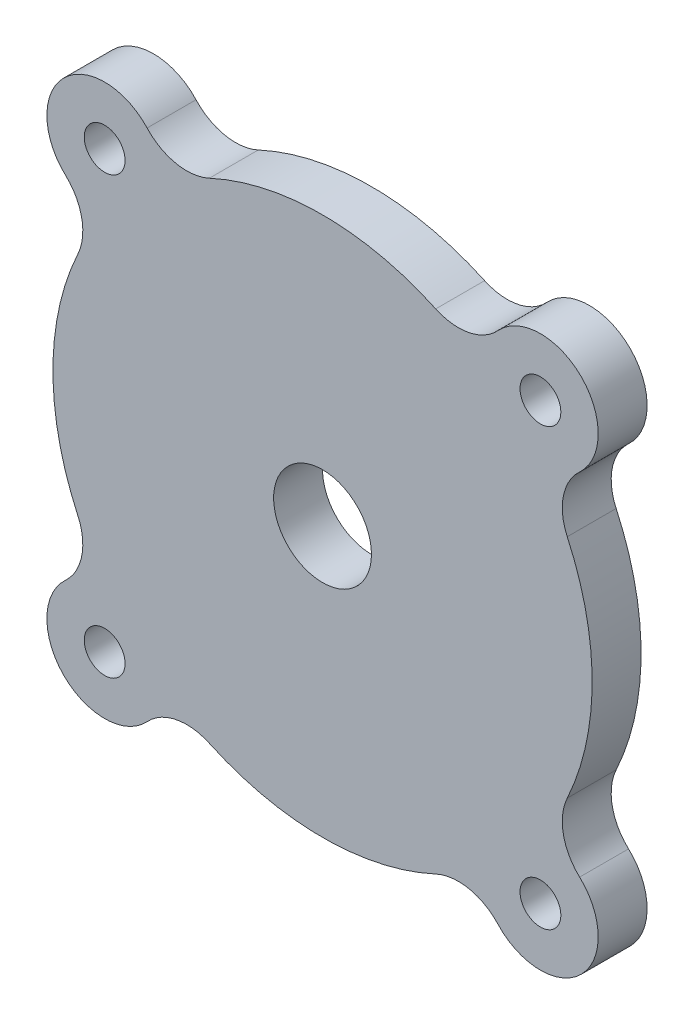
ISO-10303-21;
HEADER;
FILE_DESCRIPTION(('STEP AP214'),'2;1');
FILE_NAME('part.step','',(''),(''),'','','');
FILE_SCHEMA(('AUTOMOTIVE_DESIGN { 1 0 10303 214 1 1 1 1 }'));
ENDSEC;
DATA;
#1=APPLICATION_CONTEXT('core data for automotive mechanical design processes');
#2=APPLICATION_PROTOCOL_DEFINITION('international standard','automotive_design',2000,#1);
#3=PRODUCT_CONTEXT('',#1,'mechanical');
#4=PRODUCT('Part','Part','',(#3));
#5=PRODUCT_RELATED_PRODUCT_CATEGORY('part','',(#4));
#6=PRODUCT_DEFINITION_FORMATION('','',#4);
#7=PRODUCT_DEFINITION_CONTEXT('part definition',#1,'design');
#8=PRODUCT_DEFINITION('design','',#6,#7);
#9=PRODUCT_DEFINITION_SHAPE('','',#8);
#10=(LENGTH_UNIT() NAMED_UNIT(*) SI_UNIT(.MILLI.,.METRE.));
#11=(NAMED_UNIT(*) PLANE_ANGLE_UNIT() SI_UNIT($,.RADIAN.));
#12=(NAMED_UNIT(*) SI_UNIT($,.STERADIAN.) SOLID_ANGLE_UNIT());
#13=UNCERTAINTY_MEASURE_WITH_UNIT(LENGTH_MEASURE(1.E-05),#10,'distance_accuracy_value','');
#14=(GEOMETRIC_REPRESENTATION_CONTEXT(3) GLOBAL_UNCERTAINTY_ASSIGNED_CONTEXT((#13)) GLOBAL_UNIT_ASSIGNED_CONTEXT((#10,
#11,#12)) REPRESENTATION_CONTEXT('',''));
#15=CARTESIAN_POINT('',(0.,0.,0.));
#16=DIRECTION('',(0.,0.,1.));
#17=DIRECTION('',(1.,0.,0.));
#18=AXIS2_PLACEMENT_3D('',#15,#16,#17);
#19=CARTESIAN_POINT('',(0.,0.,3.175));
#20=DIRECTION('',(0.,0.,-1.));
#21=DIRECTION('',(-1.,0.,0.));
#22=AXIS2_PLACEMENT_3D('',#19,#20,#21);
#23=CYLINDRICAL_SURFACE('',#22,35.);
#24=CARTESIAN_POINT('',(0.,0.,3.175));
#25=DIRECTION('',(0.,0.,1.));
#26=DIRECTION('',(-1.,0.,0.));
#27=AXIS2_PLACEMENT_3D('',#24,#25,#26);
#28=CIRCLE('',#27,35.);
#29=CARTESIAN_POINT('',(14.6921496209077,31.7669756117396,3.175));
#30=VERTEX_POINT('',#29);
#31=CARTESIAN_POINT('',(-14.6921496209078,31.7669756117396,3.175));
#32=VERTEX_POINT('',#31);
#33=EDGE_CURVE('E198',#30,#32,#28,.T.);
#34=ORIENTED_EDGE('',*,*,#33,.F.);
#35=DIRECTION('',(0.,0.,-1.));
#36=VECTOR('',#35,1.);
#37=CARTESIAN_POINT('',(14.6921496209077,31.7669756117396,3.175));
#38=LINE('',#37,#36);
#39=CARTESIAN_POINT('',(14.6921496209077,31.7669756117396,-3.175));
#40=VERTEX_POINT('',#39);
#41=EDGE_CURVE('E160',#30,#40,#38,.T.);
#42=ORIENTED_EDGE('',*,*,#41,.T.);
#43=CARTESIAN_POINT('',(0.,0.,-3.175));
#44=DIRECTION('',(0.,0.,1.));
#45=DIRECTION('',(-1.,0.,0.));
#46=AXIS2_PLACEMENT_3D('',#43,#44,#45);
#47=CIRCLE('',#46,35.);
#48=CARTESIAN_POINT('',(-14.6921496209078,31.7669756117396,-3.175));
#49=VERTEX_POINT('',#48);
#50=EDGE_CURVE('E183',#40,#49,#47,.T.);
#51=ORIENTED_EDGE('',*,*,#50,.T.);
#52=DIRECTION('',(0.,0.,-1.));
#53=VECTOR('',#52,1.);
#54=CARTESIAN_POINT('',(-14.6921496209078,31.7669756117396,3.175));
#55=LINE('',#54,#53);
#56=EDGE_CURVE('E50',#49,#32,#55,.F.);
#57=ORIENTED_EDGE('',*,*,#56,.T.);
#58=EDGE_LOOP('',(#34,#42,#51,#57));
#59=FACE_BOUND('',#58,.T.);
#60=ADVANCED_FACE('F35',(#59),#23,.T.);
#61=CARTESIAN_POINT('',(-28.2842712474619,28.2842712474619,3.175));
#62=DIRECTION('',(0.,0.,-1.));
#63=DIRECTION('',(-1.,0.,0.));
#64=AXIS2_PLACEMENT_3D('',#61,#62,#63);
#65=CYLINDRICAL_SURFACE('',#64,7.50000000000001);
#66=CARTESIAN_POINT('',(-28.2842712474619,28.2842712474619,-3.175));
#67=DIRECTION('',(0.,0.,1.));
#68=DIRECTION('',(1.,0.,0.));
#69=AXIS2_PLACEMENT_3D('',#66,#67,#68);
#70=CIRCLE('',#69,7.50000000000001);
#71=CARTESIAN_POINT('',(-22.7737410565795,33.3719089129579,-3.175));
#72=VERTEX_POINT('',#71);
#73=CARTESIAN_POINT('',(-33.3719089129579,22.7737410565795,-3.175));
#74=VERTEX_POINT('',#73);
#75=EDGE_CURVE('E178',#72,#74,#70,.T.);
#76=ORIENTED_EDGE('',*,*,#75,.T.);
#77=DIRECTION('',(0.,0.,-1.));
#78=VECTOR('',#77,1.);
#79=CARTESIAN_POINT('',(-33.3719089129579,22.7737410565795,3.175));
#80=LINE('',#79,#78);
#81=CARTESIAN_POINT('',(-33.3719089129579,22.7737410565795,3.175));
#82=VERTEX_POINT('',#81);
#83=EDGE_CURVE('E154',#74,#82,#80,.F.);
#84=ORIENTED_EDGE('',*,*,#83,.T.);
#85=CARTESIAN_POINT('',(-28.2842712474619,28.2842712474619,3.175));
#86=DIRECTION('',(0.,0.,1.));
#87=DIRECTION('',(1.,0.,0.));
#88=AXIS2_PLACEMENT_3D('',#85,#86,#87);
#89=CIRCLE('',#88,7.50000000000001);
#90=CARTESIAN_POINT('',(-22.7737410565795,33.3719089129579,3.175));
#91=VERTEX_POINT('',#90);
#92=EDGE_CURVE('E262',#91,#82,#89,.T.);
#93=ORIENTED_EDGE('',*,*,#92,.F.);
#94=DIRECTION('',(0.,0.,-1.));
#95=VECTOR('',#94,1.);
#96=CARTESIAN_POINT('',(-22.7737410565795,33.3719089129579,3.175));
#97=LINE('',#96,#95);
#98=EDGE_CURVE('E170',#91,#72,#97,.T.);
#99=ORIENTED_EDGE('',*,*,#98,.T.);
#100=EDGE_LOOP('',(#76,#84,#93,#99));
#101=FACE_BOUND('',#100,.T.);
#102=ADVANCED_FACE('F264',(#101),#65,.T.);
#103=CARTESIAN_POINT('',(0.,0.,3.175));
#104=DIRECTION('',(0.,0.,-1.));
#105=DIRECTION('',(-1.,0.,0.));
#106=AXIS2_PLACEMENT_3D('',#103,#104,#105);
#107=CYLINDRICAL_SURFACE('',#106,35.);
#108=CARTESIAN_POINT('',(0.,0.,3.175));
#109=DIRECTION('',(0.,0.,1.));
#110=DIRECTION('',(-1.,0.,0.));
#111=AXIS2_PLACEMENT_3D('',#108,#109,#110);
#112=CIRCLE('',#111,35.);
#113=CARTESIAN_POINT('',(-31.7669756117396,14.6921496209078,3.175));
#114=VERTEX_POINT('',#113);
#115=CARTESIAN_POINT('',(-31.7669756117396,-14.6921496209078,3.175));
#116=VERTEX_POINT('',#115);
#117=EDGE_CURVE('E169',#114,#116,#112,.T.);
#118=ORIENTED_EDGE('',*,*,#117,.F.);
#119=DIRECTION('',(0.,0.,-1.));
#120=VECTOR('',#119,1.);
#121=CARTESIAN_POINT('',(-31.7669756117396,14.6921496209078,3.175));
#122=LINE('',#121,#120);
#123=CARTESIAN_POINT('',(-31.7669756117396,14.6921496209078,-3.175));
#124=VERTEX_POINT('',#123);
#125=EDGE_CURVE('E153',#114,#124,#122,.T.);
#126=ORIENTED_EDGE('',*,*,#125,.T.);
#127=CARTESIAN_POINT('',(0.,0.,-3.175));
#128=DIRECTION('',(0.,0.,1.));
#129=DIRECTION('',(-1.,0.,0.));
#130=AXIS2_PLACEMENT_3D('',#127,#128,#129);
#131=CIRCLE('',#130,35.);
#132=CARTESIAN_POINT('',(-31.7669756117396,-14.6921496209078,-3.175));
#133=VERTEX_POINT('',#132);
#134=EDGE_CURVE('E166',#124,#133,#131,.T.);
#135=ORIENTED_EDGE('',*,*,#134,.T.);
#136=DIRECTION('',(0.,0.,-1.));
#137=VECTOR('',#136,1.);
#138=CARTESIAN_POINT('',(-31.7669756117396,-14.6921496209078,3.175));
#139=LINE('',#138,#137);
#140=EDGE_CURVE('E171',#133,#116,#139,.F.);
#141=ORIENTED_EDGE('',*,*,#140,.T.);
#142=EDGE_LOOP('',(#118,#126,#135,#141));
#143=FACE_BOUND('',#142,.T.);
#144=ADVANCED_FACE('F165',(#143),#107,.T.);
#145=CARTESIAN_POINT('',(-28.2842712474619,-28.2842712474619,3.175));
#146=DIRECTION('',(0.,0.,-1.));
#147=DIRECTION('',(-1.,0.,0.));
#148=AXIS2_PLACEMENT_3D('',#145,#146,#147);
#149=CYLINDRICAL_SURFACE('',#148,7.50000000000001);
#150=CARTESIAN_POINT('',(-28.2842712474619,-28.2842712474619,3.175));
#151=DIRECTION('',(0.,0.,1.));
#152=DIRECTION('',(1.,0.,0.));
#153=AXIS2_PLACEMENT_3D('',#150,#151,#152);
#154=CIRCLE('',#153,7.50000000000001);
#155=CARTESIAN_POINT('',(-33.3719089129579,-22.7737410565795,3.175));
#156=VERTEX_POINT('',#155);
#157=CARTESIAN_POINT('',(-22.7737410565795,-33.3719089129579,3.175));
#158=VERTEX_POINT('',#157);
#159=EDGE_CURVE('E266',#156,#158,#154,.T.);
#160=ORIENTED_EDGE('',*,*,#159,.F.);
#161=DIRECTION('',(0.,0.,-1.));
#162=VECTOR('',#161,1.);
#163=CARTESIAN_POINT('',(-33.3719089129579,-22.7737410565795,3.175));
#164=LINE('',#163,#162);
#165=CARTESIAN_POINT('',(-33.3719089129579,-22.7737410565795,-3.175));
#166=VERTEX_POINT('',#165);
#167=EDGE_CURVE('E206',#156,#166,#164,.T.);
#168=ORIENTED_EDGE('',*,*,#167,.T.);
#169=CARTESIAN_POINT('',(-28.2842712474619,-28.2842712474619,-3.175));
#170=DIRECTION('',(0.,0.,1.));
#171=DIRECTION('',(1.,0.,0.));
#172=AXIS2_PLACEMENT_3D('',#169,#170,#171);
#173=CIRCLE('',#172,7.50000000000001);
#174=CARTESIAN_POINT('',(-22.7737410565795,-33.3719089129579,-3.175));
#175=VERTEX_POINT('',#174);
#176=EDGE_CURVE('E177',#166,#175,#173,.T.);
#177=ORIENTED_EDGE('',*,*,#176,.T.);
#178=DIRECTION('',(0.,0.,-1.));
#179=VECTOR('',#178,1.);
#180=CARTESIAN_POINT('',(-22.7737410565795,-33.3719089129579,3.175));
#181=LINE('',#180,#179);
#182=EDGE_CURVE('E204',#175,#158,#181,.F.);
#183=ORIENTED_EDGE('',*,*,#182,.T.);
#184=EDGE_LOOP('',(#160,#168,#177,#183));
#185=FACE_BOUND('',#184,.T.);
#186=ADVANCED_FACE('F323',(#185),#149,.T.);
#187=CARTESIAN_POINT('',(0.,0.,3.175));
#188=DIRECTION('',(0.,0.,-1.));
#189=DIRECTION('',(-1.,0.,0.));
#190=AXIS2_PLACEMENT_3D('',#187,#188,#189);
#191=CYLINDRICAL_SURFACE('',#190,35.);
#192=CARTESIAN_POINT('',(0.,0.,3.175));
#193=DIRECTION('',(0.,0.,1.));
#194=DIRECTION('',(-1.,0.,0.));
#195=AXIS2_PLACEMENT_3D('',#192,#193,#194);
#196=CIRCLE('',#195,35.);
#197=CARTESIAN_POINT('',(-14.6921496209077,-31.7669756117396,3.175));
#198=VERTEX_POINT('',#197);
#199=CARTESIAN_POINT('',(14.6921496209077,-31.7669756117396,3.175));
#200=VERTEX_POINT('',#199);
#201=EDGE_CURVE('E273',#198,#200,#196,.T.);
#202=ORIENTED_EDGE('',*,*,#201,.F.);
#203=DIRECTION('',(0.,0.,-1.));
#204=VECTOR('',#203,1.);
#205=CARTESIAN_POINT('',(-14.6921496209077,-31.7669756117396,3.175));
#206=LINE('',#205,#204);
#207=CARTESIAN_POINT('',(-14.6921496209077,-31.7669756117396,-3.175));
#208=VERTEX_POINT('',#207);
#209=EDGE_CURVE('E211',#198,#208,#206,.T.);
#210=ORIENTED_EDGE('',*,*,#209,.T.);
#211=CARTESIAN_POINT('',(0.,0.,-3.175));
#212=DIRECTION('',(0.,0.,1.));
#213=DIRECTION('',(-1.,0.,0.));
#214=AXIS2_PLACEMENT_3D('',#211,#212,#213);
#215=CIRCLE('',#214,35.);
#216=CARTESIAN_POINT('',(14.6921496209077,-31.7669756117396,-3.175));
#217=VERTEX_POINT('',#216);
#218=EDGE_CURVE('E181',#208,#217,#215,.T.);
#219=ORIENTED_EDGE('',*,*,#218,.T.);
#220=DIRECTION('',(0.,0.,-1.));
#221=VECTOR('',#220,1.);
#222=CARTESIAN_POINT('',(14.6921496209078,-31.7669756117396,3.175));
#223=LINE('',#222,#221);
#224=EDGE_CURVE('E209',#217,#200,#223,.F.);
#225=ORIENTED_EDGE('',*,*,#224,.T.);
#226=EDGE_LOOP('',(#202,#210,#219,#225));
#227=FACE_BOUND('',#226,.T.);
#228=ADVANCED_FACE('F315',(#227),#191,.T.);
#229=CARTESIAN_POINT('',(28.2842712474619,-28.2842712474619,3.175));
#230=DIRECTION('',(0.,0.,-1.));
#231=DIRECTION('',(-1.,0.,0.));
#232=AXIS2_PLACEMENT_3D('',#229,#230,#231);
#233=CYLINDRICAL_SURFACE('',#232,7.50000000000001);
#234=CARTESIAN_POINT('',(28.2842712474619,-28.2842712474619,3.175));
#235=DIRECTION('',(0.,0.,1.));
#236=DIRECTION('',(1.,0.,0.));
#237=AXIS2_PLACEMENT_3D('',#234,#235,#236);
#238=CIRCLE('',#237,7.50000000000001);
#239=CARTESIAN_POINT('',(22.7737410565795,-33.3719089129579,3.175));
#240=VERTEX_POINT('',#239);
#241=CARTESIAN_POINT('',(33.3719089129579,-22.7737410565795,3.175));
#242=VERTEX_POINT('',#241);
#243=EDGE_CURVE('E276',#240,#242,#238,.T.);
#244=ORIENTED_EDGE('',*,*,#243,.F.);
#245=DIRECTION('',(0.,0.,-1.));
#246=VECTOR('',#245,1.);
#247=CARTESIAN_POINT('',(22.7737410565795,-33.3719089129579,3.175));
#248=LINE('',#247,#246);
#249=CARTESIAN_POINT('',(22.7737410565795,-33.3719089129579,-3.175));
#250=VERTEX_POINT('',#249);
#251=EDGE_CURVE('E216',#240,#250,#248,.T.);
#252=ORIENTED_EDGE('',*,*,#251,.T.);
#253=CARTESIAN_POINT('',(28.2842712474619,-28.2842712474619,-3.175));
#254=DIRECTION('',(0.,0.,1.));
#255=DIRECTION('',(1.,0.,0.));
#256=AXIS2_PLACEMENT_3D('',#253,#254,#255);
#257=CIRCLE('',#256,7.50000000000001);
#258=CARTESIAN_POINT('',(33.3719089129579,-22.7737410565795,-3.175));
#259=VERTEX_POINT('',#258);
#260=EDGE_CURVE('E189',#250,#259,#257,.T.);
#261=ORIENTED_EDGE('',*,*,#260,.T.);
#262=DIRECTION('',(0.,0.,-1.));
#263=VECTOR('',#262,1.);
#264=CARTESIAN_POINT('',(33.3719089129579,-22.7737410565795,3.175));
#265=LINE('',#264,#263);
#266=EDGE_CURVE('E214',#259,#242,#265,.F.);
#267=ORIENTED_EDGE('',*,*,#266,.T.);
#268=EDGE_LOOP('',(#244,#252,#261,#267));
#269=FACE_BOUND('',#268,.T.);
#270=ADVANCED_FACE('F306',(#269),#233,.T.);
#271=CARTESIAN_POINT('',(0.,0.,3.175));
#272=DIRECTION('',(0.,0.,-1.));
#273=DIRECTION('',(-1.,0.,0.));
#274=AXIS2_PLACEMENT_3D('',#271,#272,#273);
#275=CYLINDRICAL_SURFACE('',#274,35.);
#276=CARTESIAN_POINT('',(0.,0.,3.175));
#277=DIRECTION('',(0.,0.,1.));
#278=DIRECTION('',(-1.,0.,0.));
#279=AXIS2_PLACEMENT_3D('',#276,#277,#278);
#280=CIRCLE('',#279,35.);
#281=CARTESIAN_POINT('',(31.7669756117396,-14.6921496209078,3.175));
#282=VERTEX_POINT('',#281);
#283=CARTESIAN_POINT('',(31.7669756117396,14.6921496209078,3.175));
#284=VERTEX_POINT('',#283);
#285=EDGE_CURVE('E279',#282,#284,#280,.T.);
#286=ORIENTED_EDGE('',*,*,#285,.F.);
#287=DIRECTION('',(0.,0.,-1.));
#288=VECTOR('',#287,1.);
#289=CARTESIAN_POINT('',(31.7669756117396,-14.6921496209078,3.175));
#290=LINE('',#289,#288);
#291=CARTESIAN_POINT('',(31.7669756117396,-14.6921496209078,-3.175));
#292=VERTEX_POINT('',#291);
#293=EDGE_CURVE('E221',#282,#292,#290,.T.);
#294=ORIENTED_EDGE('',*,*,#293,.T.);
#295=CARTESIAN_POINT('',(0.,0.,-3.175));
#296=DIRECTION('',(0.,0.,1.));
#297=DIRECTION('',(-1.,0.,0.));
#298=AXIS2_PLACEMENT_3D('',#295,#296,#297);
#299=CIRCLE('',#298,35.);
#300=CARTESIAN_POINT('',(31.7669756117396,14.6921496209078,-3.175));
#301=VERTEX_POINT('',#300);
#302=EDGE_CURVE('E192',#292,#301,#299,.T.);
#303=ORIENTED_EDGE('',*,*,#302,.T.);
#304=DIRECTION('',(0.,0.,-1.));
#305=VECTOR('',#304,1.);
#306=CARTESIAN_POINT('',(31.7669756117396,14.6921496209078,3.175));
#307=LINE('',#306,#305);
#308=EDGE_CURVE('E219',#301,#284,#307,.F.);
#309=ORIENTED_EDGE('',*,*,#308,.T.);
#310=EDGE_LOOP('',(#286,#294,#303,#309));
#311=FACE_BOUND('',#310,.T.);
#312=ADVANCED_FACE('F297',(#311),#275,.T.);
#313=CARTESIAN_POINT('',(28.2842712474619,28.2842712474619,3.175));
#314=DIRECTION('',(0.,0.,-1.));
#315=DIRECTION('',(-1.,0.,0.));
#316=AXIS2_PLACEMENT_3D('',#313,#314,#315);
#317=CYLINDRICAL_SURFACE('',#316,7.5);
#318=CARTESIAN_POINT('',(28.2842712474619,28.2842712474619,3.175));
#319=DIRECTION('',(0.,0.,1.));
#320=DIRECTION('',(1.,0.,0.));
#321=AXIS2_PLACEMENT_3D('',#318,#319,#320);
#322=CIRCLE('',#321,7.5);
#323=CARTESIAN_POINT('',(33.3719089129579,22.7737410565795,3.175));
#324=VERTEX_POINT('',#323);
#325=CARTESIAN_POINT('',(22.7737410565795,33.3719089129579,3.175));
#326=VERTEX_POINT('',#325);
#327=EDGE_CURVE('E199',#324,#326,#322,.T.);
#328=ORIENTED_EDGE('',*,*,#327,.F.);
#329=DIRECTION('',(0.,0.,-1.));
#330=VECTOR('',#329,1.);
#331=CARTESIAN_POINT('',(33.3719089129579,22.7737410565795,3.175));
#332=LINE('',#331,#330);
#333=CARTESIAN_POINT('',(33.3719089129579,22.7737410565795,-3.175));
#334=VERTEX_POINT('',#333);
#335=EDGE_CURVE('E226',#324,#334,#332,.T.);
#336=ORIENTED_EDGE('',*,*,#335,.T.);
#337=CARTESIAN_POINT('',(28.2842712474619,28.2842712474619,-3.175));
#338=DIRECTION('',(0.,0.,1.));
#339=DIRECTION('',(1.,0.,0.));
#340=AXIS2_PLACEMENT_3D('',#337,#338,#339);
#341=CIRCLE('',#340,7.5);
#342=CARTESIAN_POINT('',(22.7737410565795,33.3719089129579,-3.175));
#343=VERTEX_POINT('',#342);
#344=EDGE_CURVE('E195',#334,#343,#341,.T.);
#345=ORIENTED_EDGE('',*,*,#344,.T.);
#346=DIRECTION('',(0.,0.,-1.));
#347=VECTOR('',#346,1.);
#348=CARTESIAN_POINT('',(22.7737410565795,33.3719089129579,3.175));
#349=LINE('',#348,#347);
#350=EDGE_CURVE('E224',#343,#326,#349,.F.);
#351=ORIENTED_EDGE('',*,*,#350,.T.);
#352=EDGE_LOOP('',(#328,#336,#345,#351));
#353=FACE_BOUND('',#352,.T.);
#354=ADVANCED_FACE('F290',(#353),#317,.T.);
#355=CARTESIAN_POINT('',(14.1421356237309,14.142135623731,3.175));
#356=DIRECTION('',(0.,0.,-1.));
#357=DIRECTION('',(-1.,0.,0.));
#358=AXIS2_PLACEMENT_3D('',#355,#356,#357);
#359=PLANE('',#358);
#360=CARTESIAN_POINT('',(0.,0.,3.175));
#361=DIRECTION('',(0.,0.,1.));
#362=DIRECTION('',(1.,0.,0.));
#363=AXIS2_PLACEMENT_3D('',#360,#361,#362);
#364=CIRCLE('',#363,6.35);
#365=CARTESIAN_POINT('',(6.35,0.,3.175));
#366=VERTEX_POINT('',#365);
#367=EDGE_CURVE('E388',#366,#366,#364,.T.);
#368=ORIENTED_EDGE('',*,*,#367,.F.);
#369=EDGE_LOOP('',(#368));
#370=FACE_BOUND('',#369,.T.);
#371=CARTESIAN_POINT('',(-28.2842712474619,28.2842712474619,3.175));
#372=DIRECTION('',(0.,0.,1.));
#373=DIRECTION('',(1.,0.,0.));
#374=AXIS2_PLACEMENT_3D('',#371,#372,#373);
#375=CIRCLE('',#374,2.64999999999999);
#376=CARTESIAN_POINT('',(-25.6342712474619,28.2842712474619,3.175));
#377=VERTEX_POINT('',#376);
#378=EDGE_CURVE('E390',#377,#377,#375,.T.);
#379=ORIENTED_EDGE('',*,*,#378,.F.);
#380=EDGE_LOOP('',(#379));
#381=FACE_BOUND('',#380,.T.);
#382=CARTESIAN_POINT('',(28.2842712474619,28.2842712474619,3.175));
#383=DIRECTION('',(0.,0.,1.));
#384=DIRECTION('',(1.,0.,0.));
#385=AXIS2_PLACEMENT_3D('',#382,#383,#384);
#386=CIRCLE('',#385,2.64999999999999);
#387=CARTESIAN_POINT('',(30.9342712474619,28.2842712474619,3.175));
#388=VERTEX_POINT('',#387);
#389=EDGE_CURVE('E398',#388,#388,#386,.T.);
#390=ORIENTED_EDGE('',*,*,#389,.F.);
#391=EDGE_LOOP('',(#390));
#392=FACE_BOUND('',#391,.T.);
#393=CARTESIAN_POINT('',(28.2842712474619,-28.2842712474619,3.175));
#394=DIRECTION('',(0.,0.,1.));
#395=DIRECTION('',(1.,0.,0.));
#396=AXIS2_PLACEMENT_3D('',#393,#394,#395);
#397=CIRCLE('',#396,2.64999999999999);
#398=CARTESIAN_POINT('',(30.9342712474619,-28.2842712474619,3.175));
#399=VERTEX_POINT('',#398);
#400=EDGE_CURVE('E404',#399,#399,#397,.T.);
#401=ORIENTED_EDGE('',*,*,#400,.F.);
#402=EDGE_LOOP('',(#401));
#403=FACE_BOUND('',#402,.T.);
#404=CARTESIAN_POINT('',(-28.2842712474619,-28.2842712474619,3.175));
#405=DIRECTION('',(0.,0.,1.));
#406=DIRECTION('',(1.,0.,0.));
#407=AXIS2_PLACEMENT_3D('',#404,#405,#406);
#408=CIRCLE('',#407,2.64999999999999);
#409=CARTESIAN_POINT('',(-25.6342712474619,-28.2842712474619,3.175));
#410=VERTEX_POINT('',#409);
#411=EDGE_CURVE('E410',#410,#410,#408,.T.);
#412=ORIENTED_EDGE('',*,*,#411,.F.);
#413=EDGE_LOOP('',(#412));
#414=FACE_BOUND('',#413,.T.);
#415=ORIENTED_EDGE('',*,*,#327,.T.);
#416=CARTESIAN_POINT('',(17.6305795450893,38.1203707340876,3.175));
#417=DIRECTION('',(0.,0.,-1.));
#418=DIRECTION('',(-1.,0.,0.));
#419=AXIS2_PLACEMENT_3D('',#416,#417,#418);
#420=CIRCLE('',#419,7.);
#421=EDGE_CURVE('E57',#326,#30,#420,.T.);
#422=ORIENTED_EDGE('',*,*,#421,.T.);
#423=ORIENTED_EDGE('',*,*,#33,.T.);
#424=CARTESIAN_POINT('',(-17.6305795450893,38.1203707340876,3.175));
#425=DIRECTION('',(0.,0.,-1.));
#426=DIRECTION('',(-1.,0.,0.));
#427=AXIS2_PLACEMENT_3D('',#424,#425,#426);
#428=CIRCLE('',#427,7.);
#429=EDGE_CURVE('E11',#32,#91,#428,.T.);
#430=ORIENTED_EDGE('',*,*,#429,.T.);
#431=ORIENTED_EDGE('',*,*,#92,.T.);
#432=CARTESIAN_POINT('',(-38.1203707340876,17.6305795450893,3.175));
#433=DIRECTION('',(0.,0.,-1.));
#434=DIRECTION('',(-1.,0.,0.));
#435=AXIS2_PLACEMENT_3D('',#432,#433,#434);
#436=CIRCLE('',#435,7.);
#437=EDGE_CURVE('E159',#82,#114,#436,.T.);
#438=ORIENTED_EDGE('',*,*,#437,.T.);
#439=ORIENTED_EDGE('',*,*,#117,.T.);
#440=CARTESIAN_POINT('',(-38.1203707340876,-17.6305795450893,3.175));
#441=DIRECTION('',(0.,0.,-1.));
#442=DIRECTION('',(-1.,0.,0.));
#443=AXIS2_PLACEMENT_3D('',#440,#441,#442);
#444=CIRCLE('',#443,7.);
#445=EDGE_CURVE('E234',#116,#156,#444,.T.);
#446=ORIENTED_EDGE('',*,*,#445,.T.);
#447=ORIENTED_EDGE('',*,*,#159,.T.);
#448=CARTESIAN_POINT('',(-17.6305795450893,-38.1203707340876,3.175));
#449=DIRECTION('',(0.,0.,-1.));
#450=DIRECTION('',(-1.,0.,0.));
#451=AXIS2_PLACEMENT_3D('',#448,#449,#450);
#452=CIRCLE('',#451,7.);
#453=EDGE_CURVE('E238',#158,#198,#452,.T.);
#454=ORIENTED_EDGE('',*,*,#453,.T.);
#455=ORIENTED_EDGE('',*,*,#201,.T.);
#456=CARTESIAN_POINT('',(17.6305795450893,-38.1203707340876,3.175));
#457=DIRECTION('',(0.,0.,-1.));
#458=DIRECTION('',(-1.,0.,0.));
#459=AXIS2_PLACEMENT_3D('',#456,#457,#458);
#460=CIRCLE('',#459,7.);
#461=EDGE_CURVE('E242',#200,#240,#460,.T.);
#462=ORIENTED_EDGE('',*,*,#461,.T.);
#463=ORIENTED_EDGE('',*,*,#243,.T.);
#464=CARTESIAN_POINT('',(38.1203707340875,-17.6305795450893,3.175));
#465=DIRECTION('',(0.,0.,-1.));
#466=DIRECTION('',(-1.,0.,0.));
#467=AXIS2_PLACEMENT_3D('',#464,#465,#466);
#468=CIRCLE('',#467,7.);
#469=EDGE_CURVE('E246',#242,#282,#468,.T.);
#470=ORIENTED_EDGE('',*,*,#469,.T.);
#471=ORIENTED_EDGE('',*,*,#285,.T.);
#472=CARTESIAN_POINT('',(38.1203707340875,17.6305795450893,3.175));
#473=DIRECTION('',(0.,0.,-1.));
#474=DIRECTION('',(-1.,0.,0.));
#475=AXIS2_PLACEMENT_3D('',#472,#473,#474);
#476=CIRCLE('',#475,7.);
#477=EDGE_CURVE('E250',#284,#324,#476,.T.);
#478=ORIENTED_EDGE('',*,*,#477,.T.);
#479=EDGE_LOOP('',(#415,#422,#423,#430,#431,#438,#439,#446,#447,#454,#455,#462,#463,#470,#471,#478));
#480=FACE_BOUND('',#479,.T.);
#481=ADVANCED_FACE('F261',(#370,#381,#392,#403,#414,#480),#359,.F.);
#482=CARTESIAN_POINT('',(14.1421356237309,14.142135623731,-3.175));
#483=DIRECTION('',(0.,0.,-1.));
#484=DIRECTION('',(-1.,0.,0.));
#485=AXIS2_PLACEMENT_3D('',#482,#483,#484);
#486=PLANE('',#485);
#487=CARTESIAN_POINT('',(0.,0.,-3.175));
#488=DIRECTION('',(0.,0.,1.));
#489=DIRECTION('',(1.,0.,0.));
#490=AXIS2_PLACEMENT_3D('',#487,#488,#489);
#491=CIRCLE('',#490,6.35);
#492=CARTESIAN_POINT('',(6.35,0.,-3.175));
#493=VERTEX_POINT('',#492);
#494=EDGE_CURVE('E385',#493,#493,#491,.T.);
#495=ORIENTED_EDGE('',*,*,#494,.T.);
#496=EDGE_LOOP('',(#495));
#497=FACE_BOUND('',#496,.T.);
#498=CARTESIAN_POINT('',(-28.2842712474619,28.2842712474619,-3.17499999999999));
#499=DIRECTION('',(0.,0.,1.));
#500=DIRECTION('',(1.,0.,0.));
#501=AXIS2_PLACEMENT_3D('',#498,#499,#500);
#502=CIRCLE('',#501,2.64999999999999);
#503=CARTESIAN_POINT('',(-25.6342712474619,28.2842712474619,-3.17499999999999));
#504=VERTEX_POINT('',#503);
#505=EDGE_CURVE('E395',#504,#504,#502,.T.);
#506=ORIENTED_EDGE('',*,*,#505,.T.);
#507=EDGE_LOOP('',(#506));
#508=FACE_BOUND('',#507,.T.);
#509=CARTESIAN_POINT('',(28.2842712474619,28.2842712474619,-3.17499999999999));
#510=DIRECTION('',(0.,0.,1.));
#511=DIRECTION('',(1.,0.,0.));
#512=AXIS2_PLACEMENT_3D('',#509,#510,#511);
#513=CIRCLE('',#512,2.64999999999999);
#514=CARTESIAN_POINT('',(30.9342712474619,28.2842712474619,-3.17499999999999));
#515=VERTEX_POINT('',#514);
#516=EDGE_CURVE('E401',#515,#515,#513,.T.);
#517=ORIENTED_EDGE('',*,*,#516,.T.);
#518=EDGE_LOOP('',(#517));
#519=FACE_BOUND('',#518,.T.);
#520=CARTESIAN_POINT('',(28.2842712474619,-28.2842712474619,-3.17499999999999));
#521=DIRECTION('',(0.,0.,1.));
#522=DIRECTION('',(1.,0.,0.));
#523=AXIS2_PLACEMENT_3D('',#520,#521,#522);
#524=CIRCLE('',#523,2.64999999999999);
#525=CARTESIAN_POINT('',(30.9342712474619,-28.2842712474619,-3.17499999999999));
#526=VERTEX_POINT('',#525);
#527=EDGE_CURVE('E407',#526,#526,#524,.T.);
#528=ORIENTED_EDGE('',*,*,#527,.T.);
#529=EDGE_LOOP('',(#528));
#530=FACE_BOUND('',#529,.T.);
#531=CARTESIAN_POINT('',(-28.2842712474619,-28.2842712474619,-3.17499999999999));
#532=DIRECTION('',(0.,0.,1.));
#533=DIRECTION('',(1.,0.,0.));
#534=AXIS2_PLACEMENT_3D('',#531,#532,#533);
#535=CIRCLE('',#534,2.64999999999999);
#536=CARTESIAN_POINT('',(-25.6342712474619,-28.2842712474619,-3.17499999999999));
#537=VERTEX_POINT('',#536);
#538=EDGE_CURVE('E257',#537,#537,#535,.T.);
#539=ORIENTED_EDGE('',*,*,#538,.T.);
#540=EDGE_LOOP('',(#539));
#541=FACE_BOUND('',#540,.T.);
#542=ORIENTED_EDGE('',*,*,#50,.F.);
#543=CARTESIAN_POINT('',(17.6305795450893,38.1203707340876,-3.175));
#544=DIRECTION('',(0.,0.,-1.));
#545=DIRECTION('',(-1.,0.,0.));
#546=AXIS2_PLACEMENT_3D('',#543,#544,#545);
#547=CIRCLE('',#546,7.);
#548=EDGE_CURVE('E252',#40,#343,#547,.F.);
#549=ORIENTED_EDGE('',*,*,#548,.T.);
#550=ORIENTED_EDGE('',*,*,#344,.F.);
#551=CARTESIAN_POINT('',(38.1203707340875,17.6305795450893,-3.175));
#552=DIRECTION('',(0.,0.,-1.));
#553=DIRECTION('',(-1.,0.,0.));
#554=AXIS2_PLACEMENT_3D('',#551,#552,#553);
#555=CIRCLE('',#554,7.);
#556=EDGE_CURVE('E248',#334,#301,#555,.F.);
#557=ORIENTED_EDGE('',*,*,#556,.T.);
#558=ORIENTED_EDGE('',*,*,#302,.F.);
#559=CARTESIAN_POINT('',(38.1203707340875,-17.6305795450893,-3.175));
#560=DIRECTION('',(0.,0.,-1.));
#561=DIRECTION('',(-1.,0.,0.));
#562=AXIS2_PLACEMENT_3D('',#559,#560,#561);
#563=CIRCLE('',#562,7.);
#564=EDGE_CURVE('E244',#292,#259,#563,.F.);
#565=ORIENTED_EDGE('',*,*,#564,.T.);
#566=ORIENTED_EDGE('',*,*,#260,.F.);
#567=CARTESIAN_POINT('',(17.6305795450893,-38.1203707340876,-3.175));
#568=DIRECTION('',(0.,0.,-1.));
#569=DIRECTION('',(-1.,0.,0.));
#570=AXIS2_PLACEMENT_3D('',#567,#568,#569);
#571=CIRCLE('',#570,7.);
#572=EDGE_CURVE('E240',#250,#217,#571,.F.);
#573=ORIENTED_EDGE('',*,*,#572,.T.);
#574=ORIENTED_EDGE('',*,*,#218,.F.);
#575=CARTESIAN_POINT('',(-17.6305795450893,-38.1203707340876,-3.175));
#576=DIRECTION('',(0.,0.,-1.));
#577=DIRECTION('',(-1.,0.,0.));
#578=AXIS2_PLACEMENT_3D('',#575,#576,#577);
#579=CIRCLE('',#578,7.);
#580=EDGE_CURVE('E236',#208,#175,#579,.F.);
#581=ORIENTED_EDGE('',*,*,#580,.T.);
#582=ORIENTED_EDGE('',*,*,#176,.F.);
#583=CARTESIAN_POINT('',(-38.1203707340876,-17.6305795450893,-3.175));
#584=DIRECTION('',(0.,0.,-1.));
#585=DIRECTION('',(-1.,0.,0.));
#586=AXIS2_PLACEMENT_3D('',#583,#584,#585);
#587=CIRCLE('',#586,7.);
#588=EDGE_CURVE('E176',#166,#133,#587,.F.);
#589=ORIENTED_EDGE('',*,*,#588,.T.);
#590=ORIENTED_EDGE('',*,*,#134,.F.);
#591=CARTESIAN_POINT('',(-38.1203707340876,17.6305795450893,-3.175));
#592=DIRECTION('',(0.,0.,-1.));
#593=DIRECTION('',(-1.,0.,0.));
#594=AXIS2_PLACEMENT_3D('',#591,#592,#593);
#595=CIRCLE('',#594,7.);
#596=EDGE_CURVE('E149',#124,#74,#595,.F.);
#597=ORIENTED_EDGE('',*,*,#596,.T.);
#598=ORIENTED_EDGE('',*,*,#75,.F.);
#599=CARTESIAN_POINT('',(-17.6305795450893,38.1203707340876,-3.175));
#600=DIRECTION('',(0.,0.,-1.));
#601=DIRECTION('',(-1.,0.,0.));
#602=AXIS2_PLACEMENT_3D('',#599,#600,#601);
#603=CIRCLE('',#602,7.);
#604=EDGE_CURVE('E43',#72,#49,#603,.F.);
#605=ORIENTED_EDGE('',*,*,#604,.T.);
#606=EDGE_LOOP('',(#542,#549,#550,#557,#558,#565,#566,#573,#574,#581,#582,#589,#590,#597,#598,#605));
#607=FACE_BOUND('',#606,.T.);
#608=ADVANCED_FACE('F174',(#497,#508,#519,#530,#541,#607),#486,.T.);
#609=CARTESIAN_POINT('',(-38.1203707340876,17.6305795450893,3.175));
#610=DIRECTION('',(0.,0.,1.));
#611=DIRECTION('',(1.,0.,0.));
#612=AXIS2_PLACEMENT_3D('',#609,#610,#611);
#613=CYLINDRICAL_SURFACE('',#612,7.);
#614=ORIENTED_EDGE('',*,*,#437,.F.);
#615=ORIENTED_EDGE('',*,*,#83,.F.);
#616=ORIENTED_EDGE('',*,*,#596,.F.);
#617=ORIENTED_EDGE('',*,*,#125,.F.);
#618=EDGE_LOOP('',(#614,#615,#616,#617));
#619=FACE_BOUND('',#618,.T.);
#620=ADVANCED_FACE('F152',(#619),#613,.F.);
#621=CARTESIAN_POINT('',(-38.1203707340876,-17.6305795450893,3.175));
#622=DIRECTION('',(0.,0.,1.));
#623=DIRECTION('',(1.,0.,0.));
#624=AXIS2_PLACEMENT_3D('',#621,#622,#623);
#625=CYLINDRICAL_SURFACE('',#624,7.);
#626=ORIENTED_EDGE('',*,*,#445,.F.);
#627=ORIENTED_EDGE('',*,*,#140,.F.);
#628=ORIENTED_EDGE('',*,*,#588,.F.);
#629=ORIENTED_EDGE('',*,*,#167,.F.);
#630=EDGE_LOOP('',(#626,#627,#628,#629));
#631=FACE_BOUND('',#630,.T.);
#632=ADVANCED_FACE('F327',(#631),#625,.F.);
#633=CARTESIAN_POINT('',(-17.6305795450893,-38.1203707340876,3.175));
#634=DIRECTION('',(0.,0.,1.));
#635=DIRECTION('',(1.,0.,0.));
#636=AXIS2_PLACEMENT_3D('',#633,#634,#635);
#637=CYLINDRICAL_SURFACE('',#636,7.);
#638=ORIENTED_EDGE('',*,*,#453,.F.);
#639=ORIENTED_EDGE('',*,*,#182,.F.);
#640=ORIENTED_EDGE('',*,*,#580,.F.);
#641=ORIENTED_EDGE('',*,*,#209,.F.);
#642=EDGE_LOOP('',(#638,#639,#640,#641));
#643=FACE_BOUND('',#642,.T.);
#644=ADVANCED_FACE('F319',(#643),#637,.F.);
#645=CARTESIAN_POINT('',(17.6305795450893,-38.1203707340876,3.175));
#646=DIRECTION('',(0.,0.,1.));
#647=DIRECTION('',(1.,0.,0.));
#648=AXIS2_PLACEMENT_3D('',#645,#646,#647);
#649=CYLINDRICAL_SURFACE('',#648,7.);
#650=ORIENTED_EDGE('',*,*,#461,.F.);
#651=ORIENTED_EDGE('',*,*,#224,.F.);
#652=ORIENTED_EDGE('',*,*,#572,.F.);
#653=ORIENTED_EDGE('',*,*,#251,.F.);
#654=EDGE_LOOP('',(#650,#651,#652,#653));
#655=FACE_BOUND('',#654,.T.);
#656=ADVANCED_FACE('F310',(#655),#649,.F.);
#657=CARTESIAN_POINT('',(38.1203707340875,-17.6305795450893,3.175));
#658=DIRECTION('',(0.,0.,1.));
#659=DIRECTION('',(1.,0.,0.));
#660=AXIS2_PLACEMENT_3D('',#657,#658,#659);
#661=CYLINDRICAL_SURFACE('',#660,7.);
#662=ORIENTED_EDGE('',*,*,#469,.F.);
#663=ORIENTED_EDGE('',*,*,#266,.F.);
#664=ORIENTED_EDGE('',*,*,#564,.F.);
#665=ORIENTED_EDGE('',*,*,#293,.F.);
#666=EDGE_LOOP('',(#662,#663,#664,#665));
#667=FACE_BOUND('',#666,.T.);
#668=ADVANCED_FACE('F301',(#667),#661,.F.);
#669=CARTESIAN_POINT('',(38.1203707340875,17.6305795450893,3.175));
#670=DIRECTION('',(0.,0.,1.));
#671=DIRECTION('',(1.,0.,0.));
#672=AXIS2_PLACEMENT_3D('',#669,#670,#671);
#673=CYLINDRICAL_SURFACE('',#672,7.);
#674=ORIENTED_EDGE('',*,*,#477,.F.);
#675=ORIENTED_EDGE('',*,*,#308,.F.);
#676=ORIENTED_EDGE('',*,*,#556,.F.);
#677=ORIENTED_EDGE('',*,*,#335,.F.);
#678=EDGE_LOOP('',(#674,#675,#676,#677));
#679=FACE_BOUND('',#678,.T.);
#680=ADVANCED_FACE('F292',(#679),#673,.F.);
#681=CARTESIAN_POINT('',(17.6305795450893,38.1203707340876,3.175));
#682=DIRECTION('',(0.,0.,1.));
#683=DIRECTION('',(1.,0.,0.));
#684=AXIS2_PLACEMENT_3D('',#681,#682,#683);
#685=CYLINDRICAL_SURFACE('',#684,7.);
#686=ORIENTED_EDGE('',*,*,#421,.F.);
#687=ORIENTED_EDGE('',*,*,#350,.F.);
#688=ORIENTED_EDGE('',*,*,#548,.F.);
#689=ORIENTED_EDGE('',*,*,#41,.F.);
#690=EDGE_LOOP('',(#686,#687,#688,#689));
#691=FACE_BOUND('',#690,.T.);
#692=ADVANCED_FACE('F288',(#691),#685,.F.);
#693=CARTESIAN_POINT('',(-17.6305795450893,38.1203707340876,3.175));
#694=DIRECTION('',(0.,0.,1.));
#695=DIRECTION('',(1.,0.,0.));
#696=AXIS2_PLACEMENT_3D('',#693,#694,#695);
#697=CYLINDRICAL_SURFACE('',#696,7.);
#698=ORIENTED_EDGE('',*,*,#429,.F.);
#699=ORIENTED_EDGE('',*,*,#56,.F.);
#700=ORIENTED_EDGE('',*,*,#604,.F.);
#701=ORIENTED_EDGE('',*,*,#98,.F.);
#702=EDGE_LOOP('',(#698,#699,#700,#701));
#703=FACE_BOUND('',#702,.T.);
#704=ADVANCED_FACE('F37',(#703),#697,.F.);
#705=CARTESIAN_POINT('',(-28.2842712474619,-28.2842712474619,3.175));
#706=DIRECTION('',(0.,0.,1.));
#707=DIRECTION('',(1.,0.,0.));
#708=AXIS2_PLACEMENT_3D('',#705,#706,#707);
#709=CYLINDRICAL_SURFACE('',#708,2.64999999999999);
#710=ORIENTED_EDGE('',*,*,#538,.F.);
#711=EDGE_LOOP('',(#710));
#712=FACE_BOUND('',#711,.T.);
#713=ORIENTED_EDGE('',*,*,#411,.T.);
#714=EDGE_LOOP('',(#713));
#715=FACE_BOUND('',#714,.T.);
#716=ADVANCED_FACE('F361',(#712,#715),#709,.F.);
#717=CARTESIAN_POINT('',(28.2842712474619,-28.2842712474619,3.175));
#718=DIRECTION('',(0.,0.,1.));
#719=DIRECTION('',(1.,0.,0.));
#720=AXIS2_PLACEMENT_3D('',#717,#718,#719);
#721=CYLINDRICAL_SURFACE('',#720,2.64999999999999);
#722=ORIENTED_EDGE('',*,*,#527,.F.);
#723=EDGE_LOOP('',(#722));
#724=FACE_BOUND('',#723,.T.);
#725=ORIENTED_EDGE('',*,*,#400,.T.);
#726=EDGE_LOOP('',(#725));
#727=FACE_BOUND('',#726,.T.);
#728=ADVANCED_FACE('F364',(#724,#727),#721,.F.);
#729=CARTESIAN_POINT('',(28.2842712474619,28.2842712474619,3.175));
#730=DIRECTION('',(0.,0.,1.));
#731=DIRECTION('',(1.,0.,0.));
#732=AXIS2_PLACEMENT_3D('',#729,#730,#731);
#733=CYLINDRICAL_SURFACE('',#732,2.64999999999999);
#734=ORIENTED_EDGE('',*,*,#516,.F.);
#735=EDGE_LOOP('',(#734));
#736=FACE_BOUND('',#735,.T.);
#737=ORIENTED_EDGE('',*,*,#389,.T.);
#738=EDGE_LOOP('',(#737));
#739=FACE_BOUND('',#738,.T.);
#740=ADVANCED_FACE('F368',(#736,#739),#733,.F.);
#741=CARTESIAN_POINT('',(-28.2842712474619,28.2842712474619,3.175));
#742=DIRECTION('',(0.,0.,1.));
#743=DIRECTION('',(1.,0.,0.));
#744=AXIS2_PLACEMENT_3D('',#741,#742,#743);
#745=CYLINDRICAL_SURFACE('',#744,2.64999999999999);
#746=ORIENTED_EDGE('',*,*,#505,.F.);
#747=EDGE_LOOP('',(#746));
#748=FACE_BOUND('',#747,.T.);
#749=ORIENTED_EDGE('',*,*,#378,.T.);
#750=EDGE_LOOP('',(#749));
#751=FACE_BOUND('',#750,.T.);
#752=ADVANCED_FACE('F372',(#748,#751),#745,.F.);
#753=CARTESIAN_POINT('',(0.,0.,-3.175));
#754=DIRECTION('',(0.,0.,1.));
#755=DIRECTION('',(1.,0.,0.));
#756=AXIS2_PLACEMENT_3D('',#753,#754,#755);
#757=CYLINDRICAL_SURFACE('',#756,6.35);
#758=ORIENTED_EDGE('',*,*,#494,.F.);
#759=EDGE_LOOP('',(#758));
#760=FACE_BOUND('',#759,.T.);
#761=ORIENTED_EDGE('',*,*,#367,.T.);
#762=EDGE_LOOP('',(#761));
#763=FACE_BOUND('',#762,.T.);
#764=ADVANCED_FACE('F376',(#760,#763),#757,.F.);
#765=CLOSED_SHELL('',(#60,#102,#144,#186,#228,#270,#312,#354,#481,#608,#620,#632,#644,#656,#668,
#680,#692,#704,#716,#728,#740,#752,#764));
#766=MANIFOLD_SOLID_BREP('B2',#765);
#767=ADVANCED_BREP_SHAPE_REPRESENTATION('',(#18,#766),#14);
#768=SHAPE_DEFINITION_REPRESENTATION(#9,#767);
ENDSEC;
END-ISO-10303-21;
